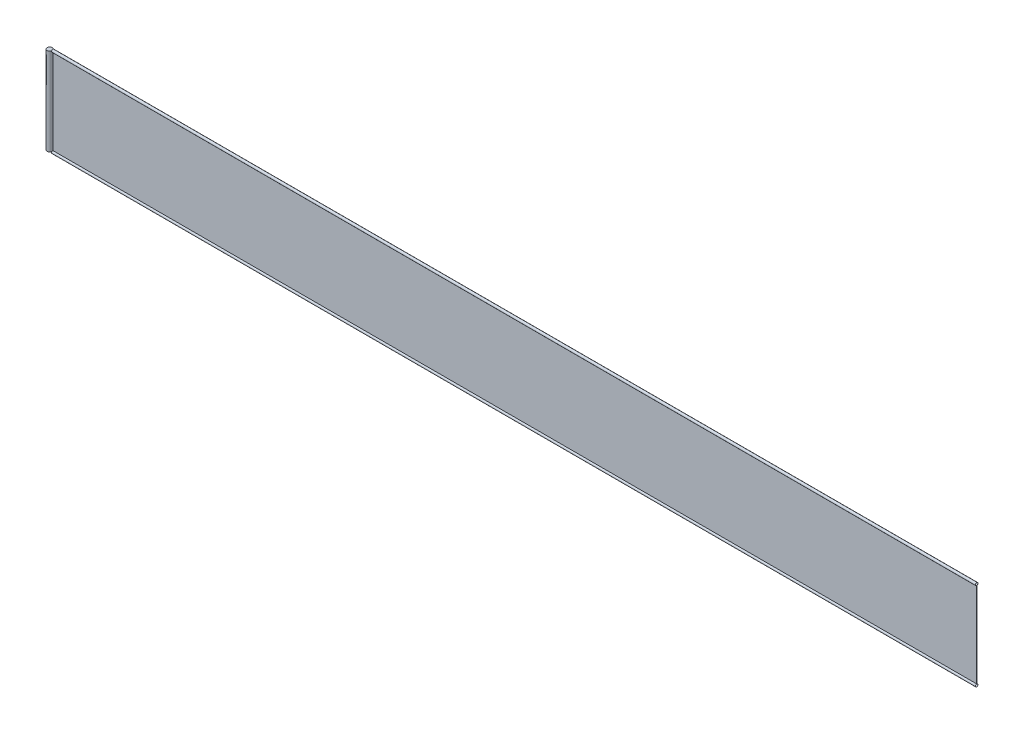
ISO-10303-21;
HEADER;
FILE_DESCRIPTION(('STEP AP214'),'2;1');
FILE_NAME('part.step','',(''),(''),'','','');
FILE_SCHEMA(('AUTOMOTIVE_DESIGN { 1 0 10303 214 1 1 1 1 }'));
ENDSEC;
DATA;
#1=APPLICATION_CONTEXT('core data for automotive mechanical design processes');
#2=APPLICATION_PROTOCOL_DEFINITION('international standard','automotive_design',2000,#1);
#3=PRODUCT_CONTEXT('',#1,'mechanical');
#4=PRODUCT('Part','Part','',(#3));
#5=PRODUCT_RELATED_PRODUCT_CATEGORY('part','',(#4));
#6=PRODUCT_DEFINITION_FORMATION('','',#4);
#7=PRODUCT_DEFINITION_CONTEXT('part definition',#1,'design');
#8=PRODUCT_DEFINITION('design','',#6,#7);
#9=PRODUCT_DEFINITION_SHAPE('','',#8);
#10=(LENGTH_UNIT() NAMED_UNIT(*) SI_UNIT(.MILLI.,.METRE.));
#11=(NAMED_UNIT(*) PLANE_ANGLE_UNIT() SI_UNIT($,.RADIAN.));
#12=(NAMED_UNIT(*) SI_UNIT($,.STERADIAN.) SOLID_ANGLE_UNIT());
#13=UNCERTAINTY_MEASURE_WITH_UNIT(LENGTH_MEASURE(1.E-05),#10,'distance_accuracy_value','');
#14=(GEOMETRIC_REPRESENTATION_CONTEXT(3) GLOBAL_UNCERTAINTY_ASSIGNED_CONTEXT((#13)) GLOBAL_UNIT_ASSIGNED_CONTEXT((#10,
#11,#12)) REPRESENTATION_CONTEXT('',''));
#15=CARTESIAN_POINT('',(0.,0.,0.));
#16=DIRECTION('',(0.,0.,1.));
#17=DIRECTION('',(1.,0.,0.));
#18=AXIS2_PLACEMENT_3D('',#15,#16,#17);
#19=CARTESIAN_POINT('',(44825.1380512305,2060.,0.));
#20=DIRECTION('',(1.,0.,0.));
#21=DIRECTION('',(0.,0.,-1.));
#22=AXIS2_PLACEMENT_3D('',#19,#20,#21);
#23=PLANE('',#22);
#24=CARTESIAN_POINT('',(44825.1380512305,2060.,0.));
#25=DIRECTION('',(1.,0.,0.));
#26=DIRECTION('',(0.,0.,-1.));
#27=AXIS2_PLACEMENT_3D('',#24,#25,#26);
#28=CIRCLE('',#27,60.);
#29=CARTESIAN_POINT('',(44825.1380512305,2060.,-60.));
#30=VERTEX_POINT('',#29);
#31=EDGE_CURVE('E11',#30,#30,#28,.T.);
#32=ORIENTED_EDGE('',*,*,#31,.T.);
#33=EDGE_LOOP('',(#32));
#34=FACE_BOUND('',#33,.T.);
#35=CARTESIAN_POINT('',(44825.1380512305,2060.,0.));
#36=DIRECTION('',(1.,0.,0.));
#37=DIRECTION('',(0.,0.,-1.));
#38=AXIS2_PLACEMENT_3D('',#35,#36,#37);
#39=CIRCLE('',#38,57.);
#40=CARTESIAN_POINT('',(44825.1380512305,2060.,-57.));
#41=VERTEX_POINT('',#40);
#42=EDGE_CURVE('E60',#41,#41,#39,.T.);
#43=ORIENTED_EDGE('',*,*,#42,.F.);
#44=EDGE_LOOP('',(#43));
#45=FACE_BOUND('',#44,.T.);
#46=ADVANCED_FACE('F46',(#34,#45),#23,.T.);
#47=CARTESIAN_POINT('',(1449.28989767983,2060.,0.));
#48=DIRECTION('',(1.,0.,0.));
#49=DIRECTION('',(0.,0.,-1.));
#50=AXIS2_PLACEMENT_3D('',#47,#48,#49);
#51=PLANE('',#50);
#52=CARTESIAN_POINT('',(1449.28989767983,2060.,0.));
#53=DIRECTION('',(1.,0.,0.));
#54=DIRECTION('',(0.,0.,-1.));
#55=AXIS2_PLACEMENT_3D('',#52,#53,#54);
#56=CIRCLE('',#55,60.);
#57=CARTESIAN_POINT('',(1449.28989767983,2060.,-60.));
#58=VERTEX_POINT('',#57);
#59=EDGE_CURVE('E49',#58,#58,#56,.T.);
#60=ORIENTED_EDGE('',*,*,#59,.F.);
#61=EDGE_LOOP('',(#60));
#62=FACE_BOUND('',#61,.T.);
#63=CARTESIAN_POINT('',(1449.28989767983,2060.,0.));
#64=DIRECTION('',(1.,0.,0.));
#65=DIRECTION('',(0.,0.,-1.));
#66=AXIS2_PLACEMENT_3D('',#63,#64,#65);
#67=CIRCLE('',#66,57.);
#68=CARTESIAN_POINT('',(1449.28989767983,2060.,-57.));
#69=VERTEX_POINT('',#68);
#70=EDGE_CURVE('E56',#69,#69,#67,.T.);
#71=ORIENTED_EDGE('',*,*,#70,.T.);
#72=EDGE_LOOP('',(#71));
#73=FACE_BOUND('',#72,.T.);
#74=ADVANCED_FACE('F66',(#62,#73),#51,.F.);
#75=CARTESIAN_POINT('',(44825.1380512305,2060.,0.));
#76=DIRECTION('',(-1.,0.,0.));
#77=DIRECTION('',(0.,0.,1.));
#78=AXIS2_PLACEMENT_3D('',#75,#76,#77);
#79=CYLINDRICAL_SURFACE('',#78,60.);
#80=ORIENTED_EDGE('',*,*,#31,.F.);
#81=EDGE_LOOP('',(#80));
#82=FACE_BOUND('',#81,.T.);
#83=ORIENTED_EDGE('',*,*,#59,.T.);
#84=EDGE_LOOP('',(#83));
#85=FACE_BOUND('',#84,.T.);
#86=ADVANCED_FACE('F48',(#82,#85),#79,.T.);
#87=CARTESIAN_POINT('',(44825.1380512305,2060.,0.));
#88=DIRECTION('',(-1.,0.,0.));
#89=DIRECTION('',(0.,0.,1.));
#90=AXIS2_PLACEMENT_3D('',#87,#88,#89);
#91=CYLINDRICAL_SURFACE('',#90,57.);
#92=ORIENTED_EDGE('',*,*,#42,.T.);
#93=EDGE_LOOP('',(#92));
#94=FACE_BOUND('',#93,.T.);
#95=ORIENTED_EDGE('',*,*,#70,.F.);
#96=EDGE_LOOP('',(#95));
#97=FACE_BOUND('',#96,.T.);
#98=ADVANCED_FACE('F61',(#94,#97),#91,.F.);
#99=CLOSED_SHELL('',(#46,#74,#86,#98));
#100=MANIFOLD_SOLID_BREP('B2',#99);
#101=CARTESIAN_POINT('',(44825.1380512305,-2060.,0.));
#102=DIRECTION('',(1.,0.,0.));
#103=DIRECTION('',(0.,0.,-1.));
#104=AXIS2_PLACEMENT_3D('',#101,#102,#103);
#105=PLANE('',#104);
#106=CARTESIAN_POINT('',(44825.1380512305,-2060.,0.));
#107=DIRECTION('',(1.,0.,0.));
#108=DIRECTION('',(0.,0.,-1.));
#109=AXIS2_PLACEMENT_3D('',#106,#107,#108);
#110=CIRCLE('',#109,60.);
#111=CARTESIAN_POINT('',(44825.1380512305,-2060.,-60.));
#112=VERTEX_POINT('',#111);
#113=EDGE_CURVE('E44',#112,#112,#110,.T.);
#114=ORIENTED_EDGE('',*,*,#113,.T.);
#115=EDGE_LOOP('',(#114));
#116=FACE_BOUND('',#115,.T.);
#117=CARTESIAN_POINT('',(44825.1380512305,-2060.,0.));
#118=DIRECTION('',(1.,0.,0.));
#119=DIRECTION('',(0.,0.,-1.));
#120=AXIS2_PLACEMENT_3D('',#117,#118,#119);
#121=CIRCLE('',#120,57.);
#122=CARTESIAN_POINT('',(44825.1380512305,-2060.,-57.));
#123=VERTEX_POINT('',#122);
#124=EDGE_CURVE('E129',#123,#123,#121,.T.);
#125=ORIENTED_EDGE('',*,*,#124,.F.);
#126=EDGE_LOOP('',(#125));
#127=FACE_BOUND('',#126,.T.);
#128=ADVANCED_FACE('F117',(#116,#127),#105,.T.);
#129=CARTESIAN_POINT('',(1449.28989767983,-2060.,0.));
#130=DIRECTION('',(1.,0.,0.));
#131=DIRECTION('',(0.,0.,-1.));
#132=AXIS2_PLACEMENT_3D('',#129,#130,#131);
#133=PLANE('',#132);
#134=CARTESIAN_POINT('',(1449.28989767983,-2060.,0.));
#135=DIRECTION('',(1.,0.,0.));
#136=DIRECTION('',(0.,0.,-1.));
#137=AXIS2_PLACEMENT_3D('',#134,#135,#136);
#138=CIRCLE('',#137,60.);
#139=CARTESIAN_POINT('',(1449.28989767983,-2060.,-60.));
#140=VERTEX_POINT('',#139);
#141=EDGE_CURVE('E124',#140,#140,#138,.T.);
#142=ORIENTED_EDGE('',*,*,#141,.F.);
#143=EDGE_LOOP('',(#142));
#144=FACE_BOUND('',#143,.T.);
#145=CARTESIAN_POINT('',(1449.28989767983,-2060.,0.));
#146=DIRECTION('',(1.,0.,0.));
#147=DIRECTION('',(0.,0.,-1.));
#148=AXIS2_PLACEMENT_3D('',#145,#146,#147);
#149=CIRCLE('',#148,57.);
#150=CARTESIAN_POINT('',(1449.28989767983,-2060.,-57.));
#151=VERTEX_POINT('',#150);
#152=EDGE_CURVE('E133',#151,#151,#149,.T.);
#153=ORIENTED_EDGE('',*,*,#152,.T.);
#154=EDGE_LOOP('',(#153));
#155=FACE_BOUND('',#154,.T.);
#156=ADVANCED_FACE('F143',(#144,#155),#133,.F.);
#157=CARTESIAN_POINT('',(44825.1380512305,-2060.,0.));
#158=DIRECTION('',(-1.,0.,0.));
#159=DIRECTION('',(0.,0.,1.));
#160=AXIS2_PLACEMENT_3D('',#157,#158,#159);
#161=CYLINDRICAL_SURFACE('',#160,60.);
#162=ORIENTED_EDGE('',*,*,#113,.F.);
#163=EDGE_LOOP('',(#162));
#164=FACE_BOUND('',#163,.T.);
#165=ORIENTED_EDGE('',*,*,#141,.T.);
#166=EDGE_LOOP('',(#165));
#167=FACE_BOUND('',#166,.T.);
#168=ADVANCED_FACE('F116',(#164,#167),#161,.T.);
#169=CARTESIAN_POINT('',(44825.1380512305,-2060.,0.));
#170=DIRECTION('',(-1.,0.,0.));
#171=DIRECTION('',(0.,0.,1.));
#172=AXIS2_PLACEMENT_3D('',#169,#170,#171);
#173=CYLINDRICAL_SURFACE('',#172,57.);
#174=ORIENTED_EDGE('',*,*,#124,.T.);
#175=EDGE_LOOP('',(#174));
#176=FACE_BOUND('',#175,.T.);
#177=ORIENTED_EDGE('',*,*,#152,.F.);
#178=EDGE_LOOP('',(#177));
#179=FACE_BOUND('',#178,.T.);
#180=ADVANCED_FACE('F139',(#176,#179),#173,.F.);
#181=CLOSED_SHELL('',(#128,#156,#168,#180));
#182=MANIFOLD_SOLID_BREP('B6',#181);
#183=CARTESIAN_POINT('',(1449.28989767983,-2000.,1.5));
#184=DIRECTION('',(1.,0.,0.));
#185=DIRECTION('',(0.,0.,-1.));
#186=AXIS2_PLACEMENT_3D('',#183,#184,#185);
#187=PLANE('',#186);
#188=DIRECTION('',(0.,-1.,0.));
#189=VECTOR('',#188,1.);
#190=CARTESIAN_POINT('',(1449.28989767983,-2000.,-1.5));
#191=LINE('',#190,#189);
#192=CARTESIAN_POINT('',(1449.28989767983,2000.,-1.5));
#193=VERTEX_POINT('',#192);
#194=CARTESIAN_POINT('',(1449.28989767983,-2000.,-1.5));
#195=VERTEX_POINT('',#194);
#196=EDGE_CURVE('E246',#193,#195,#191,.T.);
#197=ORIENTED_EDGE('',*,*,#196,.T.);
#198=DIRECTION('',(0.,0.,-1.));
#199=VECTOR('',#198,1.);
#200=CARTESIAN_POINT('',(1449.28989767983,-2000.,1.5));
#201=LINE('',#200,#199);
#202=CARTESIAN_POINT('',(1449.28989767983,-2000.,1.5));
#203=VERTEX_POINT('',#202);
#204=EDGE_CURVE('E118',#203,#195,#201,.T.);
#205=ORIENTED_EDGE('',*,*,#204,.F.);
#206=DIRECTION('',(0.,-1.,0.));
#207=VECTOR('',#206,1.);
#208=CARTESIAN_POINT('',(1449.28989767983,-2000.,1.5));
#209=LINE('',#208,#207);
#210=CARTESIAN_POINT('',(1449.28989767983,2000.,1.5));
#211=VERTEX_POINT('',#210);
#212=EDGE_CURVE('E233',#211,#203,#209,.T.);
#213=ORIENTED_EDGE('',*,*,#212,.F.);
#214=DIRECTION('',(0.,0.,-1.));
#215=VECTOR('',#214,1.);
#216=CARTESIAN_POINT('',(1449.28989767983,2000.,1.5));
#217=LINE('',#216,#215);
#218=EDGE_CURVE('E223',#211,#193,#217,.T.);
#219=ORIENTED_EDGE('',*,*,#218,.T.);
#220=EDGE_LOOP('',(#197,#205,#213,#219));
#221=FACE_BOUND('',#220,.T.);
#222=ADVANCED_FACE('F189',(#221),#187,.F.);
#223=CARTESIAN_POINT('',(1449.28989767983,-2000.,1.5));
#224=DIRECTION('',(0.,1.,0.));
#225=DIRECTION('',(0.,0.,1.));
#226=AXIS2_PLACEMENT_3D('',#223,#224,#225);
#227=PLANE('',#226);
#228=ORIENTED_EDGE('',*,*,#204,.T.);
#229=DIRECTION('',(1.,0.,0.));
#230=VECTOR('',#229,1.);
#231=CARTESIAN_POINT('',(1449.28989767983,-2000.,-1.5));
#232=LINE('',#231,#230);
#233=CARTESIAN_POINT('',(44825.1380512305,-2000.,-1.5));
#234=VERTEX_POINT('',#233);
#235=EDGE_CURVE('E243',#195,#234,#232,.T.);
#236=ORIENTED_EDGE('',*,*,#235,.T.);
#237=DIRECTION('',(0.,0.,-1.));
#238=VECTOR('',#237,1.);
#239=CARTESIAN_POINT('',(44825.1380512305,-2000.,1.5));
#240=LINE('',#239,#238);
#241=CARTESIAN_POINT('',(44825.1380512305,-2000.,1.5));
#242=VERTEX_POINT('',#241);
#243=EDGE_CURVE('E193',#242,#234,#240,.T.);
#244=ORIENTED_EDGE('',*,*,#243,.F.);
#245=DIRECTION('',(1.,0.,0.));
#246=VECTOR('',#245,1.);
#247=CARTESIAN_POINT('',(1449.28989767983,-2000.,1.5));
#248=LINE('',#247,#246);
#249=EDGE_CURVE('E232',#203,#242,#248,.T.);
#250=ORIENTED_EDGE('',*,*,#249,.F.);
#251=EDGE_LOOP('',(#228,#236,#244,#250));
#252=FACE_BOUND('',#251,.T.);
#253=ADVANCED_FACE('F239',(#252),#227,.F.);
#254=CARTESIAN_POINT('',(44825.1380512305,-2000.,1.5));
#255=DIRECTION('',(-1.,0.,0.));
#256=DIRECTION('',(0.,0.,1.));
#257=AXIS2_PLACEMENT_3D('',#254,#255,#256);
#258=PLANE('',#257);
#259=DIRECTION('',(0.,1.,0.));
#260=VECTOR('',#259,1.);
#261=CARTESIAN_POINT('',(44825.1380512305,-2000.,-1.5));
#262=LINE('',#261,#260);
#263=CARTESIAN_POINT('',(44825.1380512305,2000.,-1.5));
#264=VERTEX_POINT('',#263);
#265=EDGE_CURVE('E252',#234,#264,#262,.T.);
#266=ORIENTED_EDGE('',*,*,#265,.T.);
#267=DIRECTION('',(0.,0.,-1.));
#268=VECTOR('',#267,1.);
#269=CARTESIAN_POINT('',(44825.1380512305,2000.,1.5));
#270=LINE('',#269,#268);
#271=CARTESIAN_POINT('',(44825.1380512305,2000.,1.5));
#272=VERTEX_POINT('',#271);
#273=EDGE_CURVE('E217',#272,#264,#270,.T.);
#274=ORIENTED_EDGE('',*,*,#273,.F.);
#275=DIRECTION('',(0.,1.,0.));
#276=VECTOR('',#275,1.);
#277=CARTESIAN_POINT('',(44825.1380512305,-2000.,1.5));
#278=LINE('',#277,#276);
#279=EDGE_CURVE('E231',#242,#272,#278,.T.);
#280=ORIENTED_EDGE('',*,*,#279,.F.);
#281=ORIENTED_EDGE('',*,*,#243,.T.);
#282=EDGE_LOOP('',(#266,#274,#280,#281));
#283=FACE_BOUND('',#282,.T.);
#284=ADVANCED_FACE('F245',(#283),#258,.F.);
#285=CARTESIAN_POINT('',(1449.28989767983,2000.,1.5));
#286=DIRECTION('',(0.,-1.,0.));
#287=DIRECTION('',(0.,0.,-1.));
#288=AXIS2_PLACEMENT_3D('',#285,#286,#287);
#289=PLANE('',#288);
#290=DIRECTION('',(-1.,0.,0.));
#291=VECTOR('',#290,1.);
#292=CARTESIAN_POINT('',(1449.28989767983,2000.,-1.5));
#293=LINE('',#292,#291);
#294=EDGE_CURVE('E255',#264,#193,#293,.T.);
#295=ORIENTED_EDGE('',*,*,#294,.T.);
#296=ORIENTED_EDGE('',*,*,#218,.F.);
#297=DIRECTION('',(-1.,0.,0.));
#298=VECTOR('',#297,1.);
#299=CARTESIAN_POINT('',(1449.28989767983,2000.,1.5));
#300=LINE('',#299,#298);
#301=EDGE_CURVE('E201',#272,#211,#300,.T.);
#302=ORIENTED_EDGE('',*,*,#301,.F.);
#303=ORIENTED_EDGE('',*,*,#273,.T.);
#304=EDGE_LOOP('',(#295,#296,#302,#303));
#305=FACE_BOUND('',#304,.T.);
#306=ADVANCED_FACE('F259',(#305),#289,.F.);
#307=CARTESIAN_POINT('',(0.,0.,1.5));
#308=DIRECTION('',(0.,0.,-1.));
#309=DIRECTION('',(-1.,0.,0.));
#310=AXIS2_PLACEMENT_3D('',#307,#308,#309);
#311=PLANE('',#310);
#312=ORIENTED_EDGE('',*,*,#212,.T.);
#313=ORIENTED_EDGE('',*,*,#249,.T.);
#314=ORIENTED_EDGE('',*,*,#279,.T.);
#315=ORIENTED_EDGE('',*,*,#301,.T.);
#316=EDGE_LOOP('',(#312,#313,#314,#315));
#317=FACE_BOUND('',#316,.T.);
#318=ADVANCED_FACE('F234',(#317),#311,.F.);
#319=CARTESIAN_POINT('',(0.,0.,-1.5));
#320=DIRECTION('',(0.,0.,-1.));
#321=DIRECTION('',(-1.,0.,0.));
#322=AXIS2_PLACEMENT_3D('',#319,#320,#321);
#323=PLANE('',#322);
#324=ORIENTED_EDGE('',*,*,#196,.F.);
#325=ORIENTED_EDGE('',*,*,#294,.F.);
#326=ORIENTED_EDGE('',*,*,#265,.F.);
#327=ORIENTED_EDGE('',*,*,#235,.F.);
#328=EDGE_LOOP('',(#324,#325,#326,#327));
#329=FACE_BOUND('',#328,.T.);
#330=ADVANCED_FACE('F261',(#329),#323,.T.);
#331=CLOSED_SHELL('',(#222,#253,#284,#306,#318,#330));
#332=MANIFOLD_SOLID_BREP('B37',#331);
#333=CARTESIAN_POINT('',(1299.28989767983,2050.,0.));
#334=DIRECTION('',(0.,-1.,0.));
#335=DIRECTION('',(0.,0.,-1.));
#336=AXIS2_PLACEMENT_3D('',#333,#334,#335);
#337=CYLINDRICAL_SURFACE('',#336,120.);
#338=CARTESIAN_POINT('',(1299.28989767983,2050.,0.));
#339=DIRECTION('',(0.,1.,0.));
#340=DIRECTION('',(0.,0.,1.));
#341=AXIS2_PLACEMENT_3D('',#338,#339,#340);
#342=CIRCLE('',#341,120.);
#343=CARTESIAN_POINT('',(1299.28989767983,2050.,120.));
#344=VERTEX_POINT('',#343);
#345=EDGE_CURVE('E188',#344,#344,#342,.T.);
#346=ORIENTED_EDGE('',*,*,#345,.F.);
#347=EDGE_LOOP('',(#346));
#348=FACE_BOUND('',#347,.T.);
#349=CARTESIAN_POINT('',(1299.28989767983,-2050.,0.));
#350=DIRECTION('',(0.,1.,0.));
#351=DIRECTION('',(0.,0.,1.));
#352=AXIS2_PLACEMENT_3D('',#349,#350,#351);
#353=CIRCLE('',#352,120.);
#354=CARTESIAN_POINT('',(1299.28989767983,-2050.,120.));
#355=VERTEX_POINT('',#354);
#356=EDGE_CURVE('E314',#355,#355,#353,.T.);
#357=ORIENTED_EDGE('',*,*,#356,.T.);
#358=EDGE_LOOP('',(#357));
#359=FACE_BOUND('',#358,.T.);
#360=ADVANCED_FACE('F313',(#348,#359),#337,.T.);
#361=CARTESIAN_POINT('',(1299.28989767983,2050.,0.));
#362=DIRECTION('',(0.,1.,0.));
#363=DIRECTION('',(0.,0.,1.));
#364=AXIS2_PLACEMENT_3D('',#361,#362,#363);
#365=PLANE('',#364);
#366=ORIENTED_EDGE('',*,*,#345,.T.);
#367=EDGE_LOOP('',(#366));
#368=FACE_BOUND('',#367,.T.);
#369=ADVANCED_FACE('F326',(#368),#365,.T.);
#370=CARTESIAN_POINT('',(1299.28989767983,-2050.,0.));
#371=DIRECTION('',(0.,1.,0.));
#372=DIRECTION('',(0.,0.,1.));
#373=AXIS2_PLACEMENT_3D('',#370,#371,#372);
#374=PLANE('',#373);
#375=ORIENTED_EDGE('',*,*,#356,.F.);
#376=EDGE_LOOP('',(#375));
#377=FACE_BOUND('',#376,.T.);
#378=ADVANCED_FACE('F322',(#377),#374,.F.);
#379=CLOSED_SHELL('',(#360,#369,#378));
#380=MANIFOLD_SOLID_BREP('B109',#379);
#381=ADVANCED_BREP_SHAPE_REPRESENTATION('',(#18,#100,#182,#332,#380),#14);
#382=SHAPE_DEFINITION_REPRESENTATION(#9,#381);
ENDSEC;
END-ISO-10303-21;
